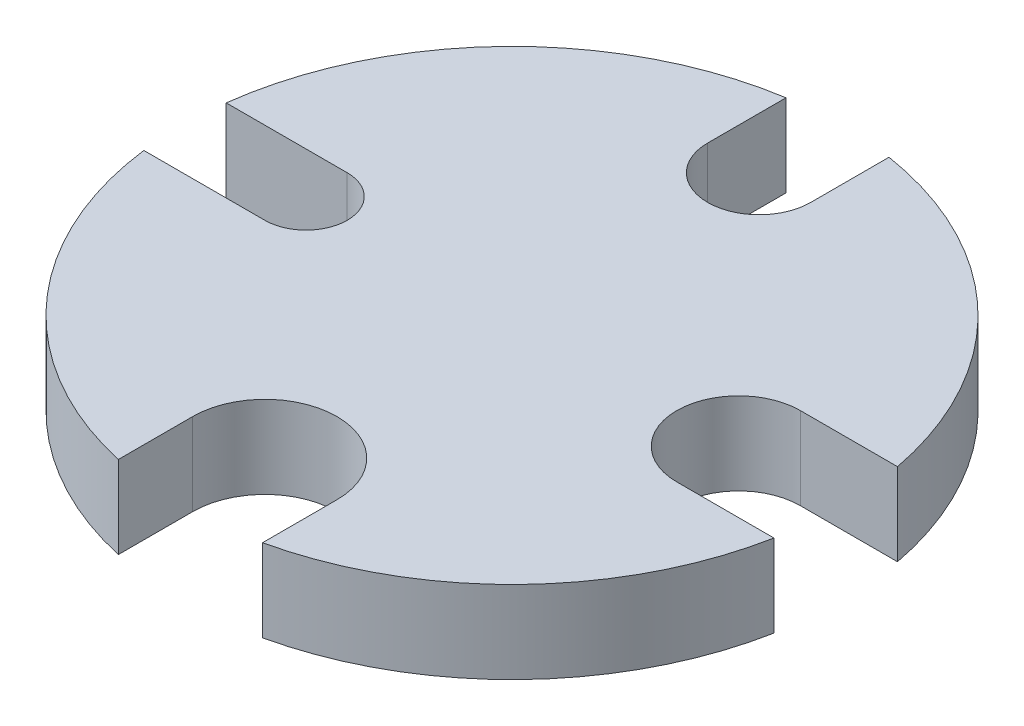
ISO-10303-21;
HEADER;
FILE_DESCRIPTION(('STEP AP214'),'2;1');
FILE_NAME('part.step','',(''),(''),'','','');
FILE_SCHEMA(('AUTOMOTIVE_DESIGN { 1 0 10303 214 1 1 1 1 }'));
ENDSEC;
DATA;
#1=APPLICATION_CONTEXT('core data for automotive mechanical design processes');
#2=APPLICATION_PROTOCOL_DEFINITION('international standard','automotive_design',2000,#1);
#3=PRODUCT_CONTEXT('',#1,'mechanical');
#4=PRODUCT('Part','Part','',(#3));
#5=PRODUCT_RELATED_PRODUCT_CATEGORY('part','',(#4));
#6=PRODUCT_DEFINITION_FORMATION('','',#4);
#7=PRODUCT_DEFINITION_CONTEXT('part definition',#1,'design');
#8=PRODUCT_DEFINITION('design','',#6,#7);
#9=PRODUCT_DEFINITION_SHAPE('','',#8);
#10=(LENGTH_UNIT() NAMED_UNIT(*) SI_UNIT(.MILLI.,.METRE.));
#11=(NAMED_UNIT(*) PLANE_ANGLE_UNIT() SI_UNIT($,.RADIAN.));
#12=(NAMED_UNIT(*) SI_UNIT($,.STERADIAN.) SOLID_ANGLE_UNIT());
#13=UNCERTAINTY_MEASURE_WITH_UNIT(LENGTH_MEASURE(1.E-05),#10,'distance_accuracy_value','');
#14=(GEOMETRIC_REPRESENTATION_CONTEXT(3) GLOBAL_UNCERTAINTY_ASSIGNED_CONTEXT((#13)) GLOBAL_UNIT_ASSIGNED_CONTEXT((#10,
#11,#12)) REPRESENTATION_CONTEXT('',''));
#15=CARTESIAN_POINT('',(0.,0.,0.));
#16=DIRECTION('',(0.,0.,1.));
#17=DIRECTION('',(1.,0.,0.));
#18=AXIS2_PLACEMENT_3D('',#15,#16,#17);
#19=CARTESIAN_POINT('',(0.,25.4,-12.7));
#20=DIRECTION('',(0.,0.,-1.));
#21=DIRECTION('',(-1.,0.,0.));
#22=AXIS2_PLACEMENT_3D('',#19,#20,#21);
#23=PLANE('',#22);
#24=DIRECTION('',(1.,0.,0.));
#25=VECTOR('',#24,1.);
#26=CARTESIAN_POINT('',(0.,0.,-12.7));
#27=LINE('',#26,#25);
#28=CARTESIAN_POINT('',(-100.803124951561,0.,-12.7));
#29=VERTEX_POINT('',#28);
#30=CARTESIAN_POINT('',(-63.5,0.,-12.7));
#31=VERTEX_POINT('',#30);
#32=EDGE_CURVE('E178',#29,#31,#27,.T.);
#33=ORIENTED_EDGE('',*,*,#32,.T.);
#34=DIRECTION('',(0.,-1.,0.));
#35=VECTOR('',#34,1.);
#36=CARTESIAN_POINT('',(-63.5,25.4,-12.7));
#37=LINE('',#36,#35);
#38=CARTESIAN_POINT('',(-63.5,25.4,-12.7));
#39=VERTEX_POINT('',#38);
#40=EDGE_CURVE('E11',#39,#31,#37,.T.);
#41=ORIENTED_EDGE('',*,*,#40,.F.);
#42=DIRECTION('',(1.,0.,0.));
#43=VECTOR('',#42,1.);
#44=CARTESIAN_POINT('',(0.,25.4,-12.7));
#45=LINE('',#44,#43);
#46=CARTESIAN_POINT('',(-100.803124951561,25.4,-12.7));
#47=VERTEX_POINT('',#46);
#48=EDGE_CURVE('E307',#47,#39,#45,.T.);
#49=ORIENTED_EDGE('',*,*,#48,.F.);
#50=DIRECTION('',(0.,-1.,0.));
#51=VECTOR('',#50,1.);
#52=CARTESIAN_POINT('',(-100.803124951561,25.4,-12.7));
#53=LINE('',#52,#51);
#54=EDGE_CURVE('E172',#47,#29,#53,.T.);
#55=ORIENTED_EDGE('',*,*,#54,.T.);
#56=EDGE_LOOP('',(#33,#41,#49,#55));
#57=FACE_BOUND('',#56,.T.);
#58=ADVANCED_FACE('F34',(#57),#23,.F.);
#59=CARTESIAN_POINT('',(-63.5,25.4,0.));
#60=DIRECTION('',(0.,-1.,0.));
#61=DIRECTION('',(0.,0.,-1.));
#62=AXIS2_PLACEMENT_3D('',#59,#60,#61);
#63=CYLINDRICAL_SURFACE('',#62,12.7);
#64=CARTESIAN_POINT('',(-63.5,0.,0.));
#65=DIRECTION('',(0.,1.,0.));
#66=DIRECTION('',(0.,0.,1.));
#67=AXIS2_PLACEMENT_3D('',#64,#65,#66);
#68=CIRCLE('',#67,12.7);
#69=CARTESIAN_POINT('',(-63.5,0.,12.7));
#70=VERTEX_POINT('',#69);
#71=EDGE_CURVE('E181',#31,#70,#68,.F.);
#72=ORIENTED_EDGE('',*,*,#71,.T.);
#73=DIRECTION('',(0.,-1.,0.));
#74=VECTOR('',#73,1.);
#75=CARTESIAN_POINT('',(-63.5,25.4,12.7));
#76=LINE('',#75,#74);
#77=CARTESIAN_POINT('',(-63.5,25.4,12.7));
#78=VERTEX_POINT('',#77);
#79=EDGE_CURVE('E42',#78,#70,#76,.T.);
#80=ORIENTED_EDGE('',*,*,#79,.F.);
#81=CARTESIAN_POINT('',(-63.5,25.4,0.));
#82=DIRECTION('',(0.,1.,0.));
#83=DIRECTION('',(0.,0.,1.));
#84=AXIS2_PLACEMENT_3D('',#81,#82,#83);
#85=CIRCLE('',#84,12.7);
#86=EDGE_CURVE('E113',#39,#78,#85,.F.);
#87=ORIENTED_EDGE('',*,*,#86,.F.);
#88=ORIENTED_EDGE('',*,*,#40,.T.);
#89=EDGE_LOOP('',(#72,#80,#87,#88));
#90=FACE_BOUND('',#89,.T.);
#91=ADVANCED_FACE('F246',(#90),#63,.F.);
#92=CARTESIAN_POINT('',(0.,25.4,12.7));
#93=DIRECTION('',(0.,0.,-1.));
#94=DIRECTION('',(-1.,0.,0.));
#95=AXIS2_PLACEMENT_3D('',#92,#93,#94);
#96=PLANE('',#95);
#97=DIRECTION('',(1.,0.,0.));
#98=VECTOR('',#97,1.);
#99=CARTESIAN_POINT('',(0.,0.,12.7));
#100=LINE('',#99,#98);
#101=CARTESIAN_POINT('',(-100.803124951561,0.,12.7));
#102=VERTEX_POINT('',#101);
#103=EDGE_CURVE('E184',#102,#70,#100,.T.);
#104=ORIENTED_EDGE('',*,*,#103,.F.);
#105=DIRECTION('',(0.,-1.,0.));
#106=VECTOR('',#105,1.);
#107=CARTESIAN_POINT('',(-100.803124951561,25.4,12.7));
#108=LINE('',#107,#106);
#109=CARTESIAN_POINT('',(-100.803124951561,25.4,12.7));
#110=VERTEX_POINT('',#109);
#111=EDGE_CURVE('E239',#110,#102,#108,.T.);
#112=ORIENTED_EDGE('',*,*,#111,.F.);
#113=DIRECTION('',(1.,0.,0.));
#114=VECTOR('',#113,1.);
#115=CARTESIAN_POINT('',(0.,25.4,12.7));
#116=LINE('',#115,#114);
#117=EDGE_CURVE('E245',#110,#78,#116,.T.);
#118=ORIENTED_EDGE('',*,*,#117,.T.);
#119=ORIENTED_EDGE('',*,*,#79,.T.);
#120=EDGE_LOOP('',(#104,#112,#118,#119));
#121=FACE_BOUND('',#120,.T.);
#122=ADVANCED_FACE('F243',(#121),#96,.T.);
#123=CARTESIAN_POINT('',(0.,25.4,0.));
#124=DIRECTION('',(0.,-1.,0.));
#125=DIRECTION('',(0.,0.,-1.));
#126=AXIS2_PLACEMENT_3D('',#123,#124,#125);
#127=CYLINDRICAL_SURFACE('',#126,101.6);
#128=CARTESIAN_POINT('',(0.,0.,0.));
#129=DIRECTION('',(0.,1.,0.));
#130=DIRECTION('',(0.,0.,1.));
#131=AXIS2_PLACEMENT_3D('',#128,#129,#130);
#132=CIRCLE('',#131,101.6);
#133=CARTESIAN_POINT('',(-22.225,0.,99.1393432245746));
#134=VERTEX_POINT('',#133);
#135=EDGE_CURVE('E187',#102,#134,#132,.T.);
#136=ORIENTED_EDGE('',*,*,#135,.T.);
#137=DIRECTION('',(0.,-1.,0.));
#138=VECTOR('',#137,1.);
#139=CARTESIAN_POINT('',(-22.225,25.4,99.1393432245746));
#140=LINE('',#139,#138);
#141=CARTESIAN_POINT('',(-22.225,25.4,99.1393432245746));
#142=VERTEX_POINT('',#141);
#143=EDGE_CURVE('E236',#142,#134,#140,.T.);
#144=ORIENTED_EDGE('',*,*,#143,.F.);
#145=CARTESIAN_POINT('',(0.,25.4,0.));
#146=DIRECTION('',(0.,1.,0.));
#147=DIRECTION('',(0.,0.,1.));
#148=AXIS2_PLACEMENT_3D('',#145,#146,#147);
#149=CIRCLE('',#148,101.6);
#150=EDGE_CURVE('E175',#110,#142,#149,.T.);
#151=ORIENTED_EDGE('',*,*,#150,.F.);
#152=ORIENTED_EDGE('',*,*,#111,.T.);
#153=EDGE_LOOP('',(#136,#144,#151,#152));
#154=FACE_BOUND('',#153,.T.);
#155=ADVANCED_FACE('F256',(#154),#127,.T.);
#156=CARTESIAN_POINT('',(-22.225,25.4,0.));
#157=DIRECTION('',(-1.,0.,0.));
#158=DIRECTION('',(0.,0.,1.));
#159=AXIS2_PLACEMENT_3D('',#156,#157,#158);
#160=PLANE('',#159);
#161=DIRECTION('',(0.,0.,-1.));
#162=VECTOR('',#161,1.);
#163=CARTESIAN_POINT('',(-22.225,0.,0.));
#164=LINE('',#163,#162);
#165=CARTESIAN_POINT('',(-22.225,0.,76.2));
#166=VERTEX_POINT('',#165);
#167=EDGE_CURVE('E189',#134,#166,#164,.T.);
#168=ORIENTED_EDGE('',*,*,#167,.T.);
#169=DIRECTION('',(0.,-1.,0.));
#170=VECTOR('',#169,1.);
#171=CARTESIAN_POINT('',(-22.225,25.4,76.2));
#172=LINE('',#171,#170);
#173=CARTESIAN_POINT('',(-22.225,25.4,76.2));
#174=VERTEX_POINT('',#173);
#175=EDGE_CURVE('E233',#174,#166,#172,.T.);
#176=ORIENTED_EDGE('',*,*,#175,.F.);
#177=DIRECTION('',(0.,0.,-1.));
#178=VECTOR('',#177,1.);
#179=CARTESIAN_POINT('',(-22.225,25.4,0.));
#180=LINE('',#179,#178);
#181=EDGE_CURVE('E262',#142,#174,#180,.T.);
#182=ORIENTED_EDGE('',*,*,#181,.F.);
#183=ORIENTED_EDGE('',*,*,#143,.T.);
#184=EDGE_LOOP('',(#168,#176,#182,#183));
#185=FACE_BOUND('',#184,.T.);
#186=ADVANCED_FACE('F260',(#185),#160,.F.);
#187=CARTESIAN_POINT('',(0.,25.4,76.2));
#188=DIRECTION('',(0.,-1.,0.));
#189=DIRECTION('',(0.,0.,-1.));
#190=AXIS2_PLACEMENT_3D('',#187,#188,#189);
#191=CYLINDRICAL_SURFACE('',#190,22.225);
#192=CARTESIAN_POINT('',(0.,0.,76.2));
#193=DIRECTION('',(0.,1.,0.));
#194=DIRECTION('',(0.,0.,1.));
#195=AXIS2_PLACEMENT_3D('',#192,#193,#194);
#196=CIRCLE('',#195,22.225);
#197=CARTESIAN_POINT('',(22.225,0.,76.2));
#198=VERTEX_POINT('',#197);
#199=EDGE_CURVE('E192',#166,#198,#196,.F.);
#200=ORIENTED_EDGE('',*,*,#199,.T.);
#201=DIRECTION('',(0.,-1.,0.));
#202=VECTOR('',#201,1.);
#203=CARTESIAN_POINT('',(22.225,25.4,76.2));
#204=LINE('',#203,#202);
#205=CARTESIAN_POINT('',(22.225,25.4,76.2));
#206=VERTEX_POINT('',#205);
#207=EDGE_CURVE('E230',#206,#198,#204,.T.);
#208=ORIENTED_EDGE('',*,*,#207,.F.);
#209=CARTESIAN_POINT('',(0.,25.4,76.2));
#210=DIRECTION('',(0.,1.,0.));
#211=DIRECTION('',(0.,0.,1.));
#212=AXIS2_PLACEMENT_3D('',#209,#210,#211);
#213=CIRCLE('',#212,22.225);
#214=EDGE_CURVE('E264',#174,#206,#213,.F.);
#215=ORIENTED_EDGE('',*,*,#214,.F.);
#216=ORIENTED_EDGE('',*,*,#175,.T.);
#217=EDGE_LOOP('',(#200,#208,#215,#216));
#218=FACE_BOUND('',#217,.T.);
#219=ADVANCED_FACE('F335',(#218),#191,.F.);
#220=CARTESIAN_POINT('',(22.225,25.4,0.));
#221=DIRECTION('',(1.,0.,0.));
#222=DIRECTION('',(0.,0.,-1.));
#223=AXIS2_PLACEMENT_3D('',#220,#221,#222);
#224=PLANE('',#223);
#225=DIRECTION('',(0.,0.,1.));
#226=VECTOR('',#225,1.);
#227=CARTESIAN_POINT('',(22.225,0.,0.));
#228=LINE('',#227,#226);
#229=CARTESIAN_POINT('',(22.225,0.,99.1393432245746));
#230=VERTEX_POINT('',#229);
#231=EDGE_CURVE('E194',#198,#230,#228,.T.);
#232=ORIENTED_EDGE('',*,*,#231,.T.);
#233=DIRECTION('',(0.,-1.,0.));
#234=VECTOR('',#233,1.);
#235=CARTESIAN_POINT('',(22.225,25.4,99.1393432245746));
#236=LINE('',#235,#234);
#237=CARTESIAN_POINT('',(22.225,25.4,99.1393432245746));
#238=VERTEX_POINT('',#237);
#239=EDGE_CURVE('E227',#238,#230,#236,.T.);
#240=ORIENTED_EDGE('',*,*,#239,.F.);
#241=DIRECTION('',(0.,0.,1.));
#242=VECTOR('',#241,1.);
#243=CARTESIAN_POINT('',(22.225,25.4,0.));
#244=LINE('',#243,#242);
#245=EDGE_CURVE('E266',#206,#238,#244,.T.);
#246=ORIENTED_EDGE('',*,*,#245,.F.);
#247=ORIENTED_EDGE('',*,*,#207,.T.);
#248=EDGE_LOOP('',(#232,#240,#246,#247));
#249=FACE_BOUND('',#248,.T.);
#250=ADVANCED_FACE('F338',(#249),#224,.F.);
#251=CARTESIAN_POINT('',(99.7980836489359,0.,19.05));
#252=VERTEX_POINT('',#251);
#253=EDGE_CURVE('E190',#230,#252,#132,.T.);
#254=ORIENTED_EDGE('',*,*,#253,.T.);
#255=DIRECTION('',(0.,-1.,0.));
#256=VECTOR('',#255,1.);
#257=CARTESIAN_POINT('',(99.7980836489359,25.4,19.05));
#258=LINE('',#257,#256);
#259=CARTESIAN_POINT('',(99.7980836489359,25.4,19.05));
#260=VERTEX_POINT('',#259);
#261=EDGE_CURVE('E224',#260,#252,#258,.T.);
#262=ORIENTED_EDGE('',*,*,#261,.F.);
#263=EDGE_CURVE('E268',#238,#260,#149,.T.);
#264=ORIENTED_EDGE('',*,*,#263,.F.);
#265=ORIENTED_EDGE('',*,*,#239,.T.);
#266=EDGE_LOOP('',(#254,#262,#264,#265));
#267=FACE_BOUND('',#266,.T.);
#268=ADVANCED_FACE('F290',(#267),#127,.T.);
#269=CARTESIAN_POINT('',(0.,25.4,19.05));
#270=DIRECTION('',(0.,0.,1.));
#271=DIRECTION('',(1.,0.,0.));
#272=AXIS2_PLACEMENT_3D('',#269,#270,#271);
#273=PLANE('',#272);
#274=DIRECTION('',(-1.,0.,0.));
#275=VECTOR('',#274,1.);
#276=CARTESIAN_POINT('',(0.,0.,19.05));
#277=LINE('',#276,#275);
#278=CARTESIAN_POINT('',(69.85,0.,19.05));
#279=VERTEX_POINT('',#278);
#280=EDGE_CURVE('E196',#252,#279,#277,.T.);
#281=ORIENTED_EDGE('',*,*,#280,.T.);
#282=DIRECTION('',(0.,-1.,0.));
#283=VECTOR('',#282,1.);
#284=CARTESIAN_POINT('',(69.85,25.4,19.05));
#285=LINE('',#284,#283);
#286=CARTESIAN_POINT('',(69.85,25.4,19.05));
#287=VERTEX_POINT('',#286);
#288=EDGE_CURVE('E222',#287,#279,#285,.T.);
#289=ORIENTED_EDGE('',*,*,#288,.F.);
#290=DIRECTION('',(-1.,0.,0.));
#291=VECTOR('',#290,1.);
#292=CARTESIAN_POINT('',(0.,25.4,19.05));
#293=LINE('',#292,#291);
#294=EDGE_CURVE('E272',#260,#287,#293,.T.);
#295=ORIENTED_EDGE('',*,*,#294,.F.);
#296=ORIENTED_EDGE('',*,*,#261,.T.);
#297=EDGE_LOOP('',(#281,#289,#295,#296));
#298=FACE_BOUND('',#297,.T.);
#299=ADVANCED_FACE('F294',(#298),#273,.F.);
#300=CARTESIAN_POINT('',(69.85,25.4,0.));
#301=DIRECTION('',(0.,-1.,0.));
#302=DIRECTION('',(0.,0.,-1.));
#303=AXIS2_PLACEMENT_3D('',#300,#301,#302);
#304=CYLINDRICAL_SURFACE('',#303,19.05);
#305=CARTESIAN_POINT('',(69.85,0.,0.));
#306=DIRECTION('',(0.,1.,0.));
#307=DIRECTION('',(0.,0.,1.));
#308=AXIS2_PLACEMENT_3D('',#305,#306,#307);
#309=CIRCLE('',#308,19.05);
#310=CARTESIAN_POINT('',(69.85,0.,-19.05));
#311=VERTEX_POINT('',#310);
#312=EDGE_CURVE('E199',#311,#279,#309,.T.);
#313=ORIENTED_EDGE('',*,*,#312,.F.);
#314=DIRECTION('',(0.,-1.,0.));
#315=VECTOR('',#314,1.);
#316=CARTESIAN_POINT('',(69.85,25.4,-19.05));
#317=LINE('',#316,#315);
#318=CARTESIAN_POINT('',(69.85,25.4,-19.05));
#319=VERTEX_POINT('',#318);
#320=EDGE_CURVE('E220',#319,#311,#317,.T.);
#321=ORIENTED_EDGE('',*,*,#320,.F.);
#322=CARTESIAN_POINT('',(69.85,25.4,0.));
#323=DIRECTION('',(0.,1.,0.));
#324=DIRECTION('',(0.,0.,1.));
#325=AXIS2_PLACEMENT_3D('',#322,#323,#324);
#326=CIRCLE('',#325,19.05);
#327=EDGE_CURVE('E274',#319,#287,#326,.T.);
#328=ORIENTED_EDGE('',*,*,#327,.T.);
#329=ORIENTED_EDGE('',*,*,#288,.T.);
#330=EDGE_LOOP('',(#313,#321,#328,#329));
#331=FACE_BOUND('',#330,.T.);
#332=ADVANCED_FACE('F297',(#331),#304,.F.);
#333=CARTESIAN_POINT('',(0.,25.4,-19.05));
#334=DIRECTION('',(0.,0.,1.));
#335=DIRECTION('',(1.,0.,0.));
#336=AXIS2_PLACEMENT_3D('',#333,#334,#335);
#337=PLANE('',#336);
#338=DIRECTION('',(-1.,0.,0.));
#339=VECTOR('',#338,1.);
#340=CARTESIAN_POINT('',(0.,0.,-19.05));
#341=LINE('',#340,#339);
#342=CARTESIAN_POINT('',(99.7980836489359,0.,-19.05));
#343=VERTEX_POINT('',#342);
#344=EDGE_CURVE('E202',#343,#311,#341,.T.);
#345=ORIENTED_EDGE('',*,*,#344,.F.);
#346=DIRECTION('',(0.,-1.,0.));
#347=VECTOR('',#346,1.);
#348=CARTESIAN_POINT('',(99.7980836489359,25.4,-19.05));
#349=LINE('',#348,#347);
#350=CARTESIAN_POINT('',(99.7980836489359,25.4,-19.05));
#351=VERTEX_POINT('',#350);
#352=EDGE_CURVE('E218',#351,#343,#349,.T.);
#353=ORIENTED_EDGE('',*,*,#352,.F.);
#354=DIRECTION('',(-1.,0.,0.));
#355=VECTOR('',#354,1.);
#356=CARTESIAN_POINT('',(0.,25.4,-19.05));
#357=LINE('',#356,#355);
#358=EDGE_CURVE('E277',#351,#319,#357,.T.);
#359=ORIENTED_EDGE('',*,*,#358,.T.);
#360=ORIENTED_EDGE('',*,*,#320,.T.);
#361=EDGE_LOOP('',(#345,#353,#359,#360));
#362=FACE_BOUND('',#361,.T.);
#363=ADVANCED_FACE('F300',(#362),#337,.T.);
#364=CARTESIAN_POINT('',(15.875,0.,-100.352101995922));
#365=VERTEX_POINT('',#364);
#366=EDGE_CURVE('E205',#343,#365,#132,.T.);
#367=ORIENTED_EDGE('',*,*,#366,.T.);
#368=DIRECTION('',(0.,-1.,0.));
#369=VECTOR('',#368,1.);
#370=CARTESIAN_POINT('',(15.875,25.4,-100.352101995922));
#371=LINE('',#370,#369);
#372=CARTESIAN_POINT('',(15.875,25.4,-100.352101995922));
#373=VERTEX_POINT('',#372);
#374=EDGE_CURVE('E215',#373,#365,#371,.T.);
#375=ORIENTED_EDGE('',*,*,#374,.F.);
#376=EDGE_CURVE('E174',#351,#373,#149,.T.);
#377=ORIENTED_EDGE('',*,*,#376,.F.);
#378=ORIENTED_EDGE('',*,*,#352,.T.);
#379=EDGE_LOOP('',(#367,#375,#377,#378));
#380=FACE_BOUND('',#379,.T.);
#381=ADVANCED_FACE('F303',(#380),#127,.T.);
#382=CARTESIAN_POINT('',(15.875,25.4,0.));
#383=DIRECTION('',(1.,0.,0.));
#384=DIRECTION('',(0.,0.,-1.));
#385=AXIS2_PLACEMENT_3D('',#382,#383,#384);
#386=PLANE('',#385);
#387=DIRECTION('',(0.,0.,1.));
#388=VECTOR('',#387,1.);
#389=CARTESIAN_POINT('',(15.875,0.,0.));
#390=LINE('',#389,#388);
#391=CARTESIAN_POINT('',(15.875,0.,-76.2));
#392=VERTEX_POINT('',#391);
#393=EDGE_CURVE('E206',#365,#392,#390,.T.);
#394=ORIENTED_EDGE('',*,*,#393,.T.);
#395=DIRECTION('',(0.,-1.,0.));
#396=VECTOR('',#395,1.);
#397=CARTESIAN_POINT('',(15.875,25.4,-76.2));
#398=LINE('',#397,#396);
#399=CARTESIAN_POINT('',(15.875,25.4,-76.2));
#400=VERTEX_POINT('',#399);
#401=EDGE_CURVE('E162',#400,#392,#398,.T.);
#402=ORIENTED_EDGE('',*,*,#401,.F.);
#403=DIRECTION('',(0.,0.,1.));
#404=VECTOR('',#403,1.);
#405=CARTESIAN_POINT('',(15.875,25.4,0.));
#406=LINE('',#405,#404);
#407=EDGE_CURVE('E167',#373,#400,#406,.T.);
#408=ORIENTED_EDGE('',*,*,#407,.F.);
#409=ORIENTED_EDGE('',*,*,#374,.T.);
#410=EDGE_LOOP('',(#394,#402,#408,#409));
#411=FACE_BOUND('',#410,.T.);
#412=ADVANCED_FACE('F306',(#411),#386,.F.);
#413=CARTESIAN_POINT('',(0.,25.4,-76.2));
#414=DIRECTION('',(0.,-1.,0.));
#415=DIRECTION('',(0.,0.,-1.));
#416=AXIS2_PLACEMENT_3D('',#413,#414,#415);
#417=CYLINDRICAL_SURFACE('',#416,15.875);
#418=CARTESIAN_POINT('',(0.,0.,-76.2));
#419=DIRECTION('',(0.,1.,0.));
#420=DIRECTION('',(0.,0.,1.));
#421=AXIS2_PLACEMENT_3D('',#418,#419,#420);
#422=CIRCLE('',#421,15.875);
#423=CARTESIAN_POINT('',(-15.875,0.,-76.2));
#424=VERTEX_POINT('',#423);
#425=EDGE_CURVE('E157',#424,#392,#422,.T.);
#426=ORIENTED_EDGE('',*,*,#425,.F.);
#427=DIRECTION('',(0.,-1.,0.));
#428=VECTOR('',#427,1.);
#429=CARTESIAN_POINT('',(-15.875,25.4,-76.2));
#430=LINE('',#429,#428);
#431=CARTESIAN_POINT('',(-15.875,25.4,-76.2));
#432=VERTEX_POINT('',#431);
#433=EDGE_CURVE('E152',#432,#424,#430,.T.);
#434=ORIENTED_EDGE('',*,*,#433,.F.);
#435=CARTESIAN_POINT('',(0.,25.4,-76.2));
#436=DIRECTION('',(0.,1.,0.));
#437=DIRECTION('',(0.,0.,1.));
#438=AXIS2_PLACEMENT_3D('',#435,#436,#437);
#439=CIRCLE('',#438,15.875);
#440=EDGE_CURVE('E155',#432,#400,#439,.T.);
#441=ORIENTED_EDGE('',*,*,#440,.T.);
#442=ORIENTED_EDGE('',*,*,#401,.T.);
#443=EDGE_LOOP('',(#426,#434,#441,#442));
#444=FACE_BOUND('',#443,.T.);
#445=ADVANCED_FACE('F154',(#444),#417,.F.);
#446=CARTESIAN_POINT('',(-15.875,25.4,0.));
#447=DIRECTION('',(1.,0.,0.));
#448=DIRECTION('',(0.,0.,-1.));
#449=AXIS2_PLACEMENT_3D('',#446,#447,#448);
#450=PLANE('',#449);
#451=DIRECTION('',(0.,0.,1.));
#452=VECTOR('',#451,1.);
#453=CARTESIAN_POINT('',(-15.875,0.,0.));
#454=LINE('',#453,#452);
#455=CARTESIAN_POINT('',(-15.875,0.,-100.352101995922));
#456=VERTEX_POINT('',#455);
#457=EDGE_CURVE('E210',#456,#424,#454,.T.);
#458=ORIENTED_EDGE('',*,*,#457,.F.);
#459=DIRECTION('',(0.,-1.,0.));
#460=VECTOR('',#459,1.);
#461=CARTESIAN_POINT('',(-15.875,25.4,-100.352101995922));
#462=LINE('',#461,#460);
#463=CARTESIAN_POINT('',(-15.875,25.4,-100.352101995922));
#464=VERTEX_POINT('',#463);
#465=EDGE_CURVE('E102',#464,#456,#462,.T.);
#466=ORIENTED_EDGE('',*,*,#465,.F.);
#467=DIRECTION('',(0.,0.,1.));
#468=VECTOR('',#467,1.);
#469=CARTESIAN_POINT('',(-15.875,25.4,0.));
#470=LINE('',#469,#468);
#471=EDGE_CURVE('E165',#464,#432,#470,.T.);
#472=ORIENTED_EDGE('',*,*,#471,.T.);
#473=ORIENTED_EDGE('',*,*,#433,.T.);
#474=EDGE_LOOP('',(#458,#466,#472,#473));
#475=FACE_BOUND('',#474,.T.);
#476=ADVANCED_FACE('F170',(#475),#450,.T.);
#477=EDGE_CURVE('E105',#456,#29,#132,.T.);
#478=ORIENTED_EDGE('',*,*,#477,.T.);
#479=ORIENTED_EDGE('',*,*,#54,.F.);
#480=EDGE_CURVE('E50',#464,#47,#149,.T.);
#481=ORIENTED_EDGE('',*,*,#480,.F.);
#482=ORIENTED_EDGE('',*,*,#465,.T.);
#483=EDGE_LOOP('',(#478,#479,#481,#482));
#484=FACE_BOUND('',#483,.T.);
#485=ADVANCED_FACE('F312',(#484),#127,.T.);
#486=CARTESIAN_POINT('',(0.,25.4,0.));
#487=DIRECTION('',(0.,1.,0.));
#488=DIRECTION('',(0.,0.,1.));
#489=AXIS2_PLACEMENT_3D('',#486,#487,#488);
#490=PLANE('',#489);
#491=ORIENTED_EDGE('',*,*,#48,.T.);
#492=ORIENTED_EDGE('',*,*,#86,.T.);
#493=ORIENTED_EDGE('',*,*,#117,.F.);
#494=ORIENTED_EDGE('',*,*,#150,.T.);
#495=ORIENTED_EDGE('',*,*,#181,.T.);
#496=ORIENTED_EDGE('',*,*,#214,.T.);
#497=ORIENTED_EDGE('',*,*,#245,.T.);
#498=ORIENTED_EDGE('',*,*,#263,.T.);
#499=ORIENTED_EDGE('',*,*,#294,.T.);
#500=ORIENTED_EDGE('',*,*,#327,.F.);
#501=ORIENTED_EDGE('',*,*,#358,.F.);
#502=ORIENTED_EDGE('',*,*,#376,.T.);
#503=ORIENTED_EDGE('',*,*,#407,.T.);
#504=ORIENTED_EDGE('',*,*,#440,.F.);
#505=ORIENTED_EDGE('',*,*,#471,.F.);
#506=ORIENTED_EDGE('',*,*,#480,.T.);
#507=EDGE_LOOP('',(#491,#492,#493,#494,#495,#496,#497,#498,#499,#500,#501,#502,#503,#504,#505,#506));
#508=FACE_BOUND('',#507,.T.);
#509=ADVANCED_FACE('F164',(#508),#490,.T.);
#510=CARTESIAN_POINT('',(0.,0.,0.));
#511=DIRECTION('',(0.,1.,0.));
#512=DIRECTION('',(0.,0.,1.));
#513=AXIS2_PLACEMENT_3D('',#510,#511,#512);
#514=PLANE('',#513);
#515=ORIENTED_EDGE('',*,*,#32,.F.);
#516=ORIENTED_EDGE('',*,*,#477,.F.);
#517=ORIENTED_EDGE('',*,*,#457,.T.);
#518=ORIENTED_EDGE('',*,*,#425,.T.);
#519=ORIENTED_EDGE('',*,*,#393,.F.);
#520=ORIENTED_EDGE('',*,*,#366,.F.);
#521=ORIENTED_EDGE('',*,*,#344,.T.);
#522=ORIENTED_EDGE('',*,*,#312,.T.);
#523=ORIENTED_EDGE('',*,*,#280,.F.);
#524=ORIENTED_EDGE('',*,*,#253,.F.);
#525=ORIENTED_EDGE('',*,*,#231,.F.);
#526=ORIENTED_EDGE('',*,*,#199,.F.);
#527=ORIENTED_EDGE('',*,*,#167,.F.);
#528=ORIENTED_EDGE('',*,*,#135,.F.);
#529=ORIENTED_EDGE('',*,*,#103,.T.);
#530=ORIENTED_EDGE('',*,*,#71,.F.);
#531=EDGE_LOOP('',(#515,#516,#517,#518,#519,#520,#521,#522,#523,#524,#525,#526,#527,#528,#529,#530));
#532=FACE_BOUND('',#531,.T.);
#533=ADVANCED_FACE('F251',(#532),#514,.F.);
#534=CLOSED_SHELL('',(#58,#91,#122,#155,#186,#219,#250,#268,#299,#332,#363,#381,#412,#445,#476,
#485,#509,#533));
#535=MANIFOLD_SOLID_BREP('B2',#534);
#536=ADVANCED_BREP_SHAPE_REPRESENTATION('',(#18,#535),#14);
#537=SHAPE_DEFINITION_REPRESENTATION(#9,#536);
ENDSEC;
END-ISO-10303-21;
